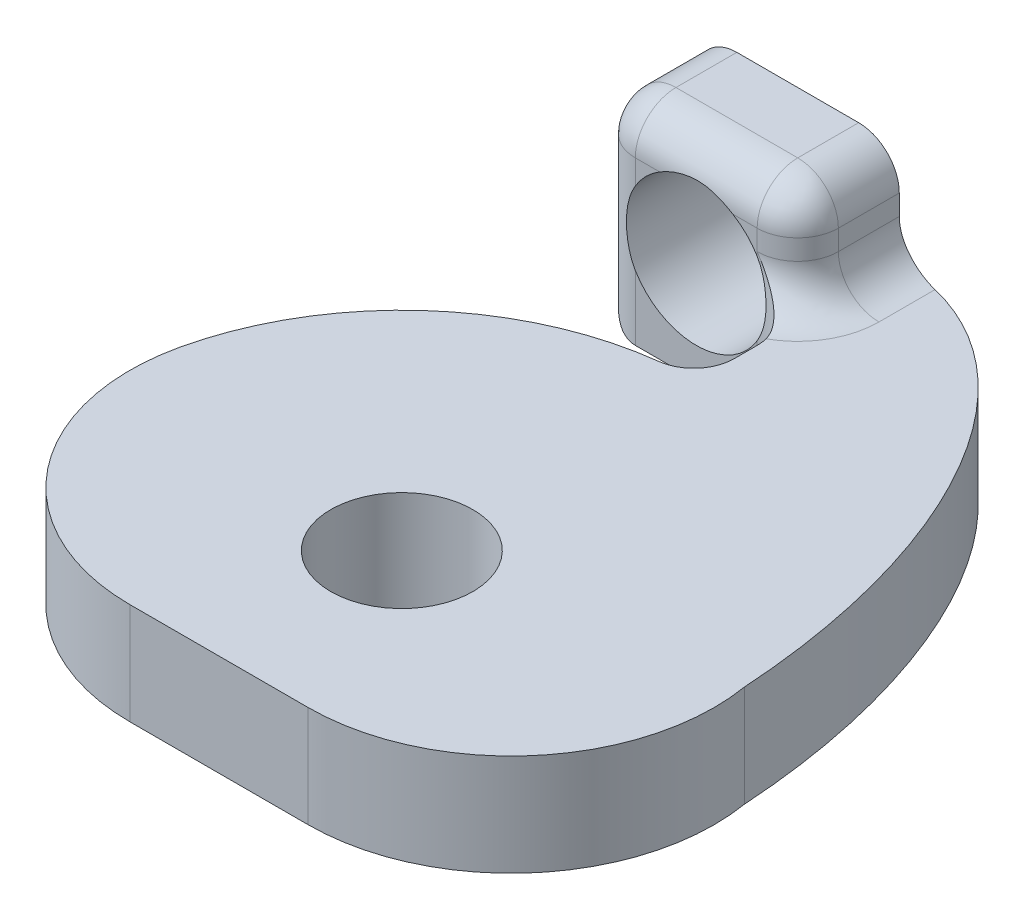
ISO-10303-21;
HEADER;
FILE_DESCRIPTION(('STEP AP214'),'2;1');
FILE_NAME('part.step','',(''),(''),'','','');
FILE_SCHEMA(('AUTOMOTIVE_DESIGN { 1 0 10303 214 1 1 1 1 }'));
ENDSEC;
DATA;
#1=APPLICATION_CONTEXT('core data for automotive mechanical design processes');
#2=APPLICATION_PROTOCOL_DEFINITION('international standard','automotive_design',2000,#1);
#3=PRODUCT_CONTEXT('',#1,'mechanical');
#4=PRODUCT('Part','Part','',(#3));
#5=PRODUCT_RELATED_PRODUCT_CATEGORY('part','',(#4));
#6=PRODUCT_DEFINITION_FORMATION('','',#4);
#7=PRODUCT_DEFINITION_CONTEXT('part definition',#1,'design');
#8=PRODUCT_DEFINITION('design','',#6,#7);
#9=PRODUCT_DEFINITION_SHAPE('','',#8);
#10=(LENGTH_UNIT() NAMED_UNIT(*) SI_UNIT(.MILLI.,.METRE.));
#11=(NAMED_UNIT(*) PLANE_ANGLE_UNIT() SI_UNIT($,.RADIAN.));
#12=(NAMED_UNIT(*) SI_UNIT($,.STERADIAN.) SOLID_ANGLE_UNIT());
#13=UNCERTAINTY_MEASURE_WITH_UNIT(LENGTH_MEASURE(1.E-05),#10,'distance_accuracy_value','');
#14=(GEOMETRIC_REPRESENTATION_CONTEXT(3) GLOBAL_UNCERTAINTY_ASSIGNED_CONTEXT((#13)) GLOBAL_UNIT_ASSIGNED_CONTEXT((#10,
#11,#12)) REPRESENTATION_CONTEXT('',''));
#15=CARTESIAN_POINT('',(0.,0.,0.));
#16=DIRECTION('',(0.,0.,1.));
#17=DIRECTION('',(1.,0.,0.));
#18=AXIS2_PLACEMENT_3D('',#15,#16,#17);
#19=CARTESIAN_POINT('',(-10.,5.,-19.5));
#20=DIRECTION('',(0.,0.,-1.));
#21=DIRECTION('',(-1.,0.,0.));
#22=AXIS2_PLACEMENT_3D('',#19,#20,#21);
#23=PLANE('',#22);
#24=DIRECTION('',(0.,-1.,0.));
#25=VECTOR('',#24,1.);
#26=CARTESIAN_POINT('',(-8.,5.,-19.5));
#27=LINE('',#26,#25);
#28=CARTESIAN_POINT('',(-8.,8.,-19.5));
#29=VERTEX_POINT('',#28);
#30=CARTESIAN_POINT('',(-8.,6.802775637732,-19.5));
#31=VERTEX_POINT('',#30);
#32=EDGE_CURVE('E203',#29,#31,#27,.T.);
#33=ORIENTED_EDGE('',*,*,#32,.T.);
#34=CARTESIAN_POINT('',(-5.,5.,-19.5));
#35=DIRECTION('',(0.,0.,-1.));
#36=DIRECTION('',(-1.,0.,0.));
#37=AXIS2_PLACEMENT_3D('',#34,#35,#36);
#38=CIRCLE('',#37,3.5);
#39=CARTESIAN_POINT('',(-6.802775637732,8.,-19.5));
#40=VERTEX_POINT('',#39);
#41=EDGE_CURVE('E190',#40,#31,#38,.F.);
#42=ORIENTED_EDGE('',*,*,#41,.F.);
#43=DIRECTION('',(1.,0.,0.));
#44=VECTOR('',#43,1.);
#45=CARTESIAN_POINT('',(-10.,8.,-19.5));
#46=LINE('',#45,#44);
#47=EDGE_CURVE('E201',#40,#29,#46,.F.);
#48=ORIENTED_EDGE('',*,*,#47,.T.);
#49=EDGE_LOOP('',(#33,#42,#48));
#50=FACE_BOUND('',#49,.T.);
#51=ADVANCED_FACE('F45',(#50),#23,.F.);
#52=CARTESIAN_POINT('',(-2.,8.,-19.5));
#53=VERTEX_POINT('',#52);
#54=CARTESIAN_POINT('',(-3.197224362268,8.,-19.5));
#55=VERTEX_POINT('',#54);
#56=EDGE_CURVE('E213',#53,#55,#46,.F.);
#57=ORIENTED_EDGE('',*,*,#56,.T.);
#58=CARTESIAN_POINT('',(-2.00000000000001,6.80277563773202,-19.5));
#59=VERTEX_POINT('',#58);
#60=EDGE_CURVE('E63',#59,#55,#38,.F.);
#61=ORIENTED_EDGE('',*,*,#60,.F.);
#62=DIRECTION('',(0.,-1.,0.));
#63=VECTOR('',#62,1.);
#64=CARTESIAN_POINT('',(-2.00000000000001,5.,-19.5));
#65=LINE('',#64,#63);
#66=CARTESIAN_POINT('',(-2.,7.,-19.5));
#67=VERTEX_POINT('',#66);
#68=EDGE_CURVE('E437',#67,#59,#65,.T.);
#69=ORIENTED_EDGE('',*,*,#68,.F.);
#70=DIRECTION('',(0.,-1.,0.));
#71=VECTOR('',#70,1.);
#72=CARTESIAN_POINT('',(-2.,10.,-19.5));
#73=LINE('',#72,#71);
#74=EDGE_CURVE('E217',#67,#53,#73,.F.);
#75=ORIENTED_EDGE('',*,*,#74,.T.);
#76=EDGE_LOOP('',(#57,#61,#69,#75));
#77=FACE_BOUND('',#76,.T.);
#78=ADVANCED_FACE('F602',(#77),#23,.F.);
#79=CARTESIAN_POINT('',(0.,5.,0.));
#80=DIRECTION('',(0.,1.,0.));
#81=DIRECTION('',(0.,0.,1.));
#82=AXIS2_PLACEMENT_3D('',#79,#80,#81);
#83=PLANE('',#82);
#84=DIRECTION('',(0.,0.,-1.));
#85=VECTOR('',#84,1.);
#86=CARTESIAN_POINT('',(2.,5.,-21.5));
#87=LINE('',#86,#85);
#88=CARTESIAN_POINT('',(2.,5.,-24.260455483341));
#89=VERTEX_POINT('',#88);
#90=CARTESIAN_POINT('',(2.,5.,-21.5));
#91=VERTEX_POINT('',#90);
#92=EDGE_CURVE('E254',#89,#91,#87,.F.);
#93=ORIENTED_EDGE('',*,*,#92,.T.);
#94=CARTESIAN_POINT('',(-2.,5.,-21.5));
#95=DIRECTION('',(0.,1.,0.));
#96=DIRECTION('',(0.,0.,1.));
#97=AXIS2_PLACEMENT_3D('',#94,#95,#96);
#98=CIRCLE('',#97,4.);
#99=CARTESIAN_POINT('',(-0.0635083268962909,5.,-18.));
#100=VERTEX_POINT('',#99);
#101=EDGE_CURVE('E284',#91,#100,#98,.F.);
#102=ORIENTED_EDGE('',*,*,#101,.T.);
#103=CARTESIAN_POINT('',(-2.,5.,-17.5));
#104=DIRECTION('',(0.,-1.,0.));
#105=DIRECTION('',(0.,0.,1.));
#106=AXIS2_PLACEMENT_3D('',#103,#104,#105);
#107=CIRCLE('',#106,2.);
#108=CARTESIAN_POINT('',(0.,5.,-17.5));
#109=VERTEX_POINT('',#108);
#110=EDGE_CURVE('E371',#100,#109,#107,.T.);
#111=ORIENTED_EDGE('',*,*,#110,.T.);
#112=DIRECTION('',(0.,0.,1.));
#113=VECTOR('',#112,1.);
#114=CARTESIAN_POINT('',(0.,5.,-17.5));
#115=LINE('',#114,#113);
#116=CARTESIAN_POINT('',(0.,5.,-16.3783393541592));
#117=VERTEX_POINT('',#116);
#118=EDGE_CURVE('E376',#109,#117,#115,.T.);
#119=ORIENTED_EDGE('',*,*,#118,.T.);
#120=CARTESIAN_POINT('',(-2.,5.,-16.3783393541592));
#121=DIRECTION('',(0.,-1.,0.));
#122=DIRECTION('',(0.,0.,-1.));
#123=AXIS2_PLACEMENT_3D('',#120,#121,#122);
#124=CIRCLE('',#123,2.);
#125=CARTESIAN_POINT('',(-1.75757575757575,5.,-14.3930860991096));
#126=VERTEX_POINT('',#125);
#127=EDGE_CURVE('E379',#117,#126,#124,.T.);
#128=ORIENTED_EDGE('',*,*,#127,.T.);
#129=CARTESIAN_POINT('',(0.,5.,0.));
#130=DIRECTION('',(0.,1.,0.));
#131=DIRECTION('',(0.,0.,1.));
#132=AXIS2_PLACEMENT_3D('',#129,#130,#131);
#133=CIRCLE('',#132,14.5);
#134=CARTESIAN_POINT('',(-14.1374426241317,5.,-3.22222222222224));
#135=VERTEX_POINT('',#134);
#136=EDGE_CURVE('E382',#126,#135,#133,.T.);
#137=ORIENTED_EDGE('',*,*,#136,.T.);
#138=CARTESIAN_POINT('',(-4.38748219369606,5.,-1.));
#139=DIRECTION('',(0.,1.,0.));
#140=DIRECTION('',(0.,0.,1.));
#141=AXIS2_PLACEMENT_3D('',#138,#139,#140);
#142=CIRCLE('',#141,10.);
#143=CARTESIAN_POINT('',(-4.38748219369606,5.,9.));
#144=VERTEX_POINT('',#143);
#145=EDGE_CURVE('E420',#135,#144,#142,.T.);
#146=ORIENTED_EDGE('',*,*,#145,.T.);
#147=DIRECTION('',(1.,0.,0.));
#148=VECTOR('',#147,1.);
#149=CARTESIAN_POINT('',(-4.38748219369606,5.,9.));
#150=LINE('',#149,#148);
#151=CARTESIAN_POINT('',(4.38748219369606,5.,9.00000000000171));
#152=VERTEX_POINT('',#151);
#153=EDGE_CURVE('E523',#144,#152,#150,.T.);
#154=ORIENTED_EDGE('',*,*,#153,.T.);
#155=CARTESIAN_POINT('',(4.38748219369606,5.,-1.));
#156=DIRECTION('',(0.,1.,0.));
#157=DIRECTION('',(0.,0.,-1.));
#158=AXIS2_PLACEMENT_3D('',#155,#156,#157);
#159=CIRCLE('',#158,10.0000000000017);
#160=CARTESIAN_POINT('',(14.2549856396273,5.,-2.62245978212194));
#161=VERTEX_POINT('',#160);
#162=EDGE_CURVE('E372',#152,#161,#159,.T.);
#163=ORIENTED_EDGE('',*,*,#162,.T.);
#164=CARTESIAN_POINT('',(0.,5.,0.));
#165=DIRECTION('',(0.,1.,0.));
#166=DIRECTION('',(0.,0.,-1.));
#167=AXIS2_PLACEMENT_3D('',#164,#165,#166);
#168=ELLIPSE('',#167,24.5,14.3373565647623);
#169=EDGE_CURVE('E365',#161,#89,#168,.T.);
#170=ORIENTED_EDGE('',*,*,#169,.T.);
#171=EDGE_LOOP('',(#93,#102,#111,#119,#128,#137,#146,#154,#163,#170));
#172=FACE_BOUND('',#171,.T.);
#173=CARTESIAN_POINT('',(0.,5.,0.));
#174=DIRECTION('',(0.,1.,0.));
#175=DIRECTION('',(0.,0.,1.));
#176=AXIS2_PLACEMENT_3D('',#173,#174,#175);
#177=CIRCLE('',#176,3.5);
#178=CARTESIAN_POINT('',(0.,5.,3.5));
#179=VERTEX_POINT('',#178);
#180=EDGE_CURVE('E391',#179,#179,#177,.T.);
#181=ORIENTED_EDGE('',*,*,#180,.F.);
#182=EDGE_LOOP('',(#181));
#183=FACE_BOUND('',#182,.T.);
#184=ADVANCED_FACE('F530',(#172,#183),#83,.T.);
#185=CARTESIAN_POINT('',(0.,0.,0.));
#186=DIRECTION('',(0.,1.,0.));
#187=DIRECTION('',(0.,0.,1.));
#188=AXIS2_PLACEMENT_3D('',#185,#186,#187);
#189=PLANE('',#188);
#190=DIRECTION('',(1.,0.,0.));
#191=VECTOR('',#190,1.);
#192=CARTESIAN_POINT('',(-10.,0.,-19.5));
#193=LINE('',#192,#191);
#194=CARTESIAN_POINT('',(-8.,0.,-19.5));
#195=VERTEX_POINT('',#194);
#196=CARTESIAN_POINT('',(-2.00000000000001,0.,-19.5));
#197=VERTEX_POINT('',#196);
#198=EDGE_CURVE('E404',#195,#197,#193,.T.);
#199=ORIENTED_EDGE('',*,*,#198,.F.);
#200=DIRECTION('',(0.,0.,1.));
#201=VECTOR('',#200,1.);
#202=CARTESIAN_POINT('',(-7.99999999999999,0.,0.));
#203=LINE('',#202,#201);
#204=CARTESIAN_POINT('',(-8.,0.,-24.5));
#205=VERTEX_POINT('',#204);
#206=EDGE_CURVE('E242',#195,#205,#203,.F.);
#207=ORIENTED_EDGE('',*,*,#206,.T.);
#208=DIRECTION('',(-1.,0.,0.));
#209=VECTOR('',#208,1.);
#210=CARTESIAN_POINT('',(0.,0.,-24.5));
#211=LINE('',#210,#209);
#212=CARTESIAN_POINT('',(0.,0.,-24.5));
#213=VERTEX_POINT('',#212);
#214=EDGE_CURVE('E400',#213,#205,#211,.T.);
#215=ORIENTED_EDGE('',*,*,#214,.F.);
#216=CARTESIAN_POINT('',(0.,0.,0.));
#217=DIRECTION('',(0.,1.,0.));
#218=DIRECTION('',(0.,0.,-1.));
#219=AXIS2_PLACEMENT_3D('',#216,#217,#218);
#220=ELLIPSE('',#219,24.5,14.3373565647623);
#221=CARTESIAN_POINT('',(14.2549856396273,0.,-2.62245978212194));
#222=VERTEX_POINT('',#221);
#223=EDGE_CURVE('E397',#222,#213,#220,.T.);
#224=ORIENTED_EDGE('',*,*,#223,.F.);
#225=CARTESIAN_POINT('',(4.38748219369606,0.,-1.));
#226=DIRECTION('',(0.,1.,0.));
#227=DIRECTION('',(0.,0.,-1.));
#228=AXIS2_PLACEMENT_3D('',#225,#226,#227);
#229=CIRCLE('',#228,10.0000000000017);
#230=CARTESIAN_POINT('',(4.38748219369606,0.,9.00000000000171));
#231=VERTEX_POINT('',#230);
#232=EDGE_CURVE('E394',#231,#222,#229,.T.);
#233=ORIENTED_EDGE('',*,*,#232,.F.);
#234=DIRECTION('',(1.,0.,0.));
#235=VECTOR('',#234,1.);
#236=CARTESIAN_POINT('',(-4.38748219369606,0.,9.));
#237=LINE('',#236,#235);
#238=CARTESIAN_POINT('',(-4.38748219369606,0.,9.));
#239=VERTEX_POINT('',#238);
#240=EDGE_CURVE('E390',#239,#231,#237,.T.);
#241=ORIENTED_EDGE('',*,*,#240,.F.);
#242=CARTESIAN_POINT('',(-4.38748219369606,0.,-1.));
#243=DIRECTION('',(0.,1.,0.));
#244=DIRECTION('',(0.,0.,1.));
#245=AXIS2_PLACEMENT_3D('',#242,#243,#244);
#246=CIRCLE('',#245,10.);
#247=CARTESIAN_POINT('',(-14.1374426241317,0.,-3.22222222222224));
#248=VERTEX_POINT('',#247);
#249=EDGE_CURVE('E386',#248,#239,#246,.T.);
#250=ORIENTED_EDGE('',*,*,#249,.F.);
#251=CARTESIAN_POINT('',(0.,0.,0.));
#252=DIRECTION('',(0.,1.,0.));
#253=DIRECTION('',(0.,0.,1.));
#254=AXIS2_PLACEMENT_3D('',#251,#252,#253);
#255=CIRCLE('',#254,14.5);
#256=CARTESIAN_POINT('',(-1.75757575757575,0.,-14.3930860991096));
#257=VERTEX_POINT('',#256);
#258=EDGE_CURVE('E417',#257,#248,#255,.T.);
#259=ORIENTED_EDGE('',*,*,#258,.F.);
#260=CARTESIAN_POINT('',(-2.,0.,-16.3783393541592));
#261=DIRECTION('',(0.,-1.,0.));
#262=DIRECTION('',(0.,0.,-1.));
#263=AXIS2_PLACEMENT_3D('',#260,#261,#262);
#264=CIRCLE('',#263,2.);
#265=CARTESIAN_POINT('',(0.,0.,-16.3783393541592));
#266=VERTEX_POINT('',#265);
#267=EDGE_CURVE('E414',#266,#257,#264,.T.);
#268=ORIENTED_EDGE('',*,*,#267,.F.);
#269=DIRECTION('',(0.,0.,1.));
#270=VECTOR('',#269,1.);
#271=CARTESIAN_POINT('',(0.,0.,-17.5));
#272=LINE('',#271,#270);
#273=CARTESIAN_POINT('',(0.,0.,-17.5));
#274=VERTEX_POINT('',#273);
#275=EDGE_CURVE('E411',#274,#266,#272,.T.);
#276=ORIENTED_EDGE('',*,*,#275,.F.);
#277=CARTESIAN_POINT('',(-2.,0.,-17.5));
#278=DIRECTION('',(0.,-1.,0.));
#279=DIRECTION('',(0.,0.,1.));
#280=AXIS2_PLACEMENT_3D('',#277,#278,#279);
#281=CIRCLE('',#280,2.);
#282=EDGE_CURVE('E408',#197,#274,#281,.T.);
#283=ORIENTED_EDGE('',*,*,#282,.F.);
#284=EDGE_LOOP('',(#199,#207,#215,#224,#233,#241,#250,#259,#268,#276,#283));
#285=FACE_BOUND('',#284,.T.);
#286=CARTESIAN_POINT('',(0.,0.,0.));
#287=DIRECTION('',(0.,1.,0.));
#288=DIRECTION('',(0.,0.,1.));
#289=AXIS2_PLACEMENT_3D('',#286,#287,#288);
#290=CIRCLE('',#289,3.5);
#291=CARTESIAN_POINT('',(0.,0.,3.5));
#292=VERTEX_POINT('',#291);
#293=EDGE_CURVE('E503',#292,#292,#290,.T.);
#294=ORIENTED_EDGE('',*,*,#293,.T.);
#295=EDGE_LOOP('',(#294));
#296=FACE_BOUND('',#295,.T.);
#297=ADVANCED_FACE('F350',(#285,#296),#189,.F.);
#298=CARTESIAN_POINT('',(-4.38748219369606,5.,-1.));
#299=DIRECTION('',(0.,-1.,0.));
#300=DIRECTION('',(0.,0.,-1.));
#301=AXIS2_PLACEMENT_3D('',#298,#299,#300);
#302=CYLINDRICAL_SURFACE('',#301,10.);
#303=ORIENTED_EDGE('',*,*,#249,.T.);
#304=DIRECTION('',(0.,-1.,0.));
#305=VECTOR('',#304,1.);
#306=CARTESIAN_POINT('',(-4.38748219369606,5.,9.));
#307=LINE('',#306,#305);
#308=EDGE_CURVE('E455',#144,#239,#307,.T.);
#309=ORIENTED_EDGE('',*,*,#308,.F.);
#310=ORIENTED_EDGE('',*,*,#145,.F.);
#311=DIRECTION('',(0.,-1.,0.));
#312=VECTOR('',#311,1.);
#313=CARTESIAN_POINT('',(-14.1374426241317,5.,-3.22222222222224));
#314=LINE('',#313,#312);
#315=EDGE_CURVE('E385',#135,#248,#314,.T.);
#316=ORIENTED_EDGE('',*,*,#315,.T.);
#317=EDGE_LOOP('',(#303,#309,#310,#316));
#318=FACE_BOUND('',#317,.T.);
#319=ADVANCED_FACE('F346',(#318),#302,.T.);
#320=CARTESIAN_POINT('',(-4.38748219369606,5.,9.));
#321=DIRECTION('',(0.,0.,-1.));
#322=DIRECTION('',(-1.,0.,0.));
#323=AXIS2_PLACEMENT_3D('',#320,#321,#322);
#324=PLANE('',#323);
#325=ORIENTED_EDGE('',*,*,#240,.T.);
#326=DIRECTION('',(0.,-1.,0.));
#327=VECTOR('',#326,1.);
#328=CARTESIAN_POINT('',(4.38748219369606,5.,9.00000000000171));
#329=LINE('',#328,#327);
#330=EDGE_CURVE('E451',#152,#231,#329,.T.);
#331=ORIENTED_EDGE('',*,*,#330,.F.);
#332=ORIENTED_EDGE('',*,*,#153,.F.);
#333=ORIENTED_EDGE('',*,*,#308,.T.);
#334=EDGE_LOOP('',(#325,#331,#332,#333));
#335=FACE_BOUND('',#334,.T.);
#336=ADVANCED_FACE('F349',(#335),#324,.F.);
#337=CARTESIAN_POINT('',(4.38748219369606,5.,-1.));
#338=DIRECTION('',(0.,-1.,0.));
#339=DIRECTION('',(0.,0.,-1.));
#340=AXIS2_PLACEMENT_3D('',#337,#338,#339);
#341=CYLINDRICAL_SURFACE('',#340,10.0000000000017);
#342=ORIENTED_EDGE('',*,*,#232,.T.);
#343=DIRECTION('',(0.,-1.,0.));
#344=VECTOR('',#343,1.);
#345=CARTESIAN_POINT('',(14.2549856396273,5.,-2.62245978212194));
#346=LINE('',#345,#344);
#347=EDGE_CURVE('E447',#161,#222,#346,.T.);
#348=ORIENTED_EDGE('',*,*,#347,.F.);
#349=ORIENTED_EDGE('',*,*,#162,.F.);
#350=ORIENTED_EDGE('',*,*,#330,.T.);
#351=EDGE_LOOP('',(#342,#348,#349,#350));
#352=FACE_BOUND('',#351,.T.);
#353=ADVANCED_FACE('F354',(#352),#341,.T.);
#354=DIRECTION('',(0.,-1.,0.));
#355=VECTOR('',#354,1.);
#356=SURFACE_OF_LINEAR_EXTRUSION('',#168,#355);
#357=ORIENTED_EDGE('',*,*,#223,.T.);
#358=DIRECTION('',(0.,-1.,0.));
#359=VECTOR('',#358,1.);
#360=CARTESIAN_POINT('',(0.,5.,-24.5));
#361=LINE('',#360,#359);
#362=CARTESIAN_POINT('',(0.,7.,-24.5));
#363=VERTEX_POINT('',#362);
#364=EDGE_CURVE('E70',#363,#213,#361,.T.);
#365=ORIENTED_EDGE('',*,*,#364,.F.);
#366=CARTESIAN_POINT('',(0.,7.,-24.5));
#367=CARTESIAN_POINT('',(-5.73329897597098E-07,6.94376198497631,-24.499996762425));
#368=CARTESIAN_POINT('',(0.0023731630430719,6.88754885701935,-24.5000003740362));
#369=CARTESIAN_POINT('',(0.011841801586754,6.77552733629461,-24.4999936050275));
#370=CARTESIAN_POINT('',(0.0189362318756099,6.71971890363699,-24.499983225806));
#371=CARTESIAN_POINT('',(0.0472313706462909,6.55358480367156,-24.4998896745324));
#372=CARTESIAN_POINT('',(0.0754441126646444,6.44437705725369,-24.4997442473447));
#373=CARTESIAN_POINT('',(0.149831074784767,6.23219837276328,-24.4987435796133));
#374=CARTESIAN_POINT('',(0.196014473399098,6.1292306528941,-24.4978879760937));
#375=CARTESIAN_POINT('',(0.277661896399248,5.98180718877938,-24.4954487502452));
#376=CARTESIAN_POINT('',(0.306943932016167,5.93383215530552,-24.4944428518072));
#377=CARTESIAN_POINT('',(0.369459751369972,5.84047524968967,-24.4919226151268));
#378=CARTESIAN_POINT('',(0.402697405456561,5.79509598269829,-24.4904077762293));
#379=CARTESIAN_POINT('',(0.507743855649595,5.66369922388755,-24.4849235257224));
#380=CARTESIAN_POINT('',(0.585092556822705,5.58205121854287,-24.4800101722659));
#381=CARTESIAN_POINT('',(0.752203059356871,5.43298557142037,-24.4666736385839));
#382=CARTESIAN_POINT('',(0.841963657429657,5.3655665517928,-24.4582507984312));
#383=CARTESIAN_POINT('',(0.983285255921126,5.27681586529151,-24.4424468503204));
#384=CARTESIAN_POINT('',(1.03129314018153,5.24938381004181,-24.4366809699894));
#385=CARTESIAN_POINT('',(1.12926343331795,5.19865224153642,-24.4240299999586));
#386=CARTESIAN_POINT('',(1.17922405676836,5.17534905629133,-24.4171459152802));
#387=CARTESIAN_POINT('',(1.2807568177799,5.13299263154228,-24.4022062853747));
#388=CARTESIAN_POINT('',(1.33232932534359,5.11394037611567,-24.3941504696069));
#389=CARTESIAN_POINT('',(1.43668103296958,5.08018725317289,-24.3768507895118));
#390=CARTESIAN_POINT('',(1.48946025774709,5.06548647486704,-24.3676069008332));
#391=CARTESIAN_POINT('',(1.61802003624888,5.03529298282747,-24.3438279422737));
#392=CARTESIAN_POINT('',(1.69422095386422,5.02202276748049,-24.3286931086078));
#393=CARTESIAN_POINT('',(1.84704419075483,5.0043690179365,-24.2962040898979));
#394=CARTESIAN_POINT('',(1.92366559564486,4.99997070449228,-24.2788536470907));
#395=CARTESIAN_POINT('',(2.,5.,-24.260455483341));
#396=B_SPLINE_CURVE_WITH_KNOTS('',3,(#366,#367,#368,#369,#370,#371,#372,#373,#374,#375,#376,
#377,#378,#379,#380,#381,#382,#383,#384,#385,#386,#387,#388,#389,#390,#391,#392,#393,#394,#395),
.UNSPECIFIED.,.F.,.F.,(4,2,2,2,2,2,2,2,2,2,2,2,2,2,4),(0.,0.168614577251063,0.337212302274285,
0.673894591463427,1.01074906731898,1.17921595581719,1.34784905623707,1.68385662791386,
2.01983164768679,2.18644258195801,2.35290458965494,2.51940509291058,2.68590900938309,
2.92179323427445,3.15728418611128),.UNSPECIFIED.);
#397=EDGE_CURVE('E11',#363,#89,#396,.T.);
#398=ORIENTED_EDGE('',*,*,#397,.T.);
#399=ORIENTED_EDGE('',*,*,#169,.F.);
#400=ORIENTED_EDGE('',*,*,#347,.T.);
#401=EDGE_LOOP('',(#357,#365,#398,#399,#400));
#402=FACE_BOUND('',#401,.T.);
#403=ADVANCED_FACE('F357',(#402),#356,.F.);
#404=CARTESIAN_POINT('',(0.,5.,-24.5));
#405=DIRECTION('',(0.,0.,1.));
#406=DIRECTION('',(1.,0.,0.));
#407=AXIS2_PLACEMENT_3D('',#404,#405,#406);
#408=PLANE('',#407);
#409=CARTESIAN_POINT('',(-5.,5.,-24.5));
#410=DIRECTION('',(0.,0.,-1.));
#411=DIRECTION('',(-1.,0.,0.));
#412=AXIS2_PLACEMENT_3D('',#409,#410,#411);
#413=CIRCLE('',#412,3.5);
#414=CARTESIAN_POINT('',(-8.5,5.,-24.5));
#415=VERTEX_POINT('',#414);
#416=EDGE_CURVE('E197',#415,#415,#413,.T.);
#417=ORIENTED_EDGE('',*,*,#416,.F.);
#418=EDGE_LOOP('',(#417));
#419=FACE_BOUND('',#418,.T.);
#420=ORIENTED_EDGE('',*,*,#214,.T.);
#421=CARTESIAN_POINT('',(-8.,2.,-24.5));
#422=DIRECTION('',(0.,0.,1.));
#423=DIRECTION('',(1.,0.,0.));
#424=AXIS2_PLACEMENT_3D('',#421,#422,#423);
#425=CIRCLE('',#424,2.);
#426=CARTESIAN_POINT('',(-10.,2.,-24.5));
#427=VERTEX_POINT('',#426);
#428=EDGE_CURVE('E251',#205,#427,#425,.F.);
#429=ORIENTED_EDGE('',*,*,#428,.T.);
#430=DIRECTION('',(0.,-1.,0.));
#431=VECTOR('',#430,1.);
#432=CARTESIAN_POINT('',(-10.,5.,-24.5));
#433=LINE('',#432,#431);
#434=CARTESIAN_POINT('',(-10.,8.,-24.5));
#435=VERTEX_POINT('',#434);
#436=EDGE_CURVE('E441',#435,#427,#433,.T.);
#437=ORIENTED_EDGE('',*,*,#436,.F.);
#438=CARTESIAN_POINT('',(-8.,8.,-24.5));
#439=DIRECTION('',(0.,0.,1.));
#440=DIRECTION('',(1.,0.,0.));
#441=AXIS2_PLACEMENT_3D('',#438,#439,#440);
#442=CIRCLE('',#441,2.);
#443=CARTESIAN_POINT('',(-8.,10.,-24.5));
#444=VERTEX_POINT('',#443);
#445=EDGE_CURVE('E248',#435,#444,#442,.F.);
#446=ORIENTED_EDGE('',*,*,#445,.T.);
#447=DIRECTION('',(1.,0.,0.));
#448=VECTOR('',#447,1.);
#449=CARTESIAN_POINT('',(0.,10.,-24.5));
#450=LINE('',#449,#448);
#451=CARTESIAN_POINT('',(-2.,10.,-24.5));
#452=VERTEX_POINT('',#451);
#453=EDGE_CURVE('E281',#444,#452,#450,.T.);
#454=ORIENTED_EDGE('',*,*,#453,.T.);
#455=CARTESIAN_POINT('',(-2.,8.,-24.5));
#456=DIRECTION('',(0.,0.,1.));
#457=DIRECTION('',(1.,0.,0.));
#458=AXIS2_PLACEMENT_3D('',#455,#456,#457);
#459=CIRCLE('',#458,2.);
#460=CARTESIAN_POINT('',(0.,8.,-24.5));
#461=VERTEX_POINT('',#460);
#462=EDGE_CURVE('E245',#452,#461,#459,.F.);
#463=ORIENTED_EDGE('',*,*,#462,.T.);
#464=DIRECTION('',(0.,-1.,0.));
#465=VECTOR('',#464,1.);
#466=CARTESIAN_POINT('',(0.,5.,-24.5));
#467=LINE('',#466,#465);
#468=EDGE_CURVE('E499',#461,#363,#467,.T.);
#469=ORIENTED_EDGE('',*,*,#468,.T.);
#470=ORIENTED_EDGE('',*,*,#364,.T.);
#471=EDGE_LOOP('',(#420,#429,#437,#446,#454,#463,#469,#470));
#472=FACE_BOUND('',#471,.T.);
#473=ADVANCED_FACE('F363',(#419,#472),#408,.F.);
#474=CARTESIAN_POINT('',(-10.,5.,-24.5));
#475=DIRECTION('',(1.,0.,0.));
#476=DIRECTION('',(0.,0.,-1.));
#477=AXIS2_PLACEMENT_3D('',#474,#475,#476);
#478=PLANE('',#477);
#479=ORIENTED_EDGE('',*,*,#436,.T.);
#480=DIRECTION('',(0.,0.,1.));
#481=VECTOR('',#480,1.);
#482=CARTESIAN_POINT('',(-10.,2.,-24.5));
#483=LINE('',#482,#481);
#484=CARTESIAN_POINT('',(-10.,2.,-21.5));
#485=VERTEX_POINT('',#484);
#486=EDGE_CURVE('E239',#427,#485,#483,.T.);
#487=ORIENTED_EDGE('',*,*,#486,.T.);
#488=DIRECTION('',(0.,-1.,0.));
#489=VECTOR('',#488,1.);
#490=CARTESIAN_POINT('',(-10.,5.,-21.5));
#491=LINE('',#490,#489);
#492=CARTESIAN_POINT('',(-10.,8.,-21.5));
#493=VERTEX_POINT('',#492);
#494=EDGE_CURVE('E236',#485,#493,#491,.F.);
#495=ORIENTED_EDGE('',*,*,#494,.T.);
#496=DIRECTION('',(0.,0.,-1.));
#497=VECTOR('',#496,1.);
#498=CARTESIAN_POINT('',(-10.,8.,-24.5));
#499=LINE('',#498,#497);
#500=EDGE_CURVE('E233',#493,#435,#499,.T.);
#501=ORIENTED_EDGE('',*,*,#500,.T.);
#502=EDGE_LOOP('',(#479,#487,#495,#501));
#503=FACE_BOUND('',#502,.T.);
#504=ADVANCED_FACE('F487',(#503),#478,.F.);
#505=CARTESIAN_POINT('',(-2.00000000000001,3.19722436226798,-19.5));
#506=VERTEX_POINT('',#505);
#507=EDGE_CURVE('E436',#506,#197,#65,.T.);
#508=ORIENTED_EDGE('',*,*,#507,.F.);
#509=CARTESIAN_POINT('',(-8.,3.197224362268,-19.5));
#510=VERTEX_POINT('',#509);
#511=EDGE_CURVE('E206',#510,#506,#38,.F.);
#512=ORIENTED_EDGE('',*,*,#511,.F.);
#513=EDGE_CURVE('E218',#510,#195,#27,.T.);
#514=ORIENTED_EDGE('',*,*,#513,.T.);
#515=ORIENTED_EDGE('',*,*,#198,.T.);
#516=EDGE_LOOP('',(#508,#512,#514,#515));
#517=FACE_BOUND('',#516,.T.);
#518=ADVANCED_FACE('F473',(#517),#23,.F.);
#519=CARTESIAN_POINT('',(-2.,5.,-17.5));
#520=DIRECTION('',(0.,-1.,0.));
#521=DIRECTION('',(0.,0.,-1.));
#522=AXIS2_PLACEMENT_3D('',#519,#520,#521);
#523=CYLINDRICAL_SURFACE('',#522,2.);
#524=ORIENTED_EDGE('',*,*,#68,.T.);
#525=CARTESIAN_POINT('',(-2.00000000000001,3.19722436226798,-19.5));
#526=CARTESIAN_POINT('',(-1.95643555946663,3.2697086866449,-19.4999827238607));
#527=CARTESIAN_POINT('',(-1.91552129647934,3.34375553579305,-19.49857650522));
#528=CARTESIAN_POINT('',(-1.83919133016534,3.49453833696708,-19.4938956727861));
#529=CARTESIAN_POINT('',(-1.80377329331528,3.57127313072181,-19.4906218546923));
#530=CARTESIAN_POINT('',(-1.73855758420693,3.72715149119125,-19.4831092592398));
#531=CARTESIAN_POINT('',(-1.70876668828382,3.80629783048534,-19.4788693318492));
#532=CARTESIAN_POINT('',(-1.65498767752938,3.96654167173229,-19.4702054324619));
#533=CARTESIAN_POINT('',(-1.63100061008219,4.04763952296452,-19.4657814274144));
#534=CARTESIAN_POINT('',(-1.58594655419738,4.22310055288928,-19.4568246335951));
#535=CARTESIAN_POINT('',(-1.56578756712462,4.31770238615583,-19.4523667455961));
#536=CARTESIAN_POINT('',(-1.53336101695524,4.50830879983314,-19.4448716005885));
#537=CARTESIAN_POINT('',(-1.5210937707798,4.60431343642019,-19.4418344006343));
#538=CARTESIAN_POINT('',(-1.50455418882323,4.79701000713327,-19.4376807882448));
#539=CARTESIAN_POINT('',(-1.50027826747245,4.89370161347007,-19.43656351439));
#540=CARTESIAN_POINT('',(-1.49974805003715,5.08710347940632,-19.4364266272096));
#541=CARTESIAN_POINT('',(-1.5034933533974,5.1838137378332,-19.4374069091384));
#542=CARTESIAN_POINT('',(-1.51894210798304,5.37618022929972,-19.441300037644));
#543=CARTESIAN_POINT('',(-1.53061491113259,5.47183908505239,-19.4442054405653));
#544=CARTESIAN_POINT('',(-1.56179495692913,5.66182690169459,-19.4514691033928));
#545=CARTESIAN_POINT('',(-1.58130335745243,5.75615566390113,-19.4558275780052));
#546=CARTESIAN_POINT('',(-1.62799965349337,5.94279530797545,-19.4652434839081));
#547=CARTESIAN_POINT('',(-1.65518310366596,6.03510732468404,-19.4703005097384));
#548=CARTESIAN_POINT('',(-1.71704978440934,6.21715889235789,-19.4801309167557));
#549=CARTESIAN_POINT('',(-1.75172968582668,6.30689956527808,-19.4849044226574));
#550=CARTESIAN_POINT('',(-1.82055491898619,6.46525859631782,-19.4921699863131));
#551=CARTESIAN_POINT('',(-1.85336316585085,6.53444795863775,-19.4949288760844));
#552=CARTESIAN_POINT('',(-1.92339798307041,6.67043865384415,-19.4988368231499));
#553=CARTESIAN_POINT('',(-1.9606164462318,6.73724408359158,-19.4999887860998));
#554=CARTESIAN_POINT('',(-2.00000000000001,6.80277563773202,-19.5));
#555=B_SPLINE_CURVE_WITH_KNOTS('',3,(#525,#526,#527,#528,#529,#530,#531,#532,#533,#534,#535,
#536,#537,#538,#539,#540,#541,#542,#543,#544,#545,#546,#547,#548,#549,#550,#551,#552,#553,#554),
.UNSPECIFIED.,.F.,.F.,(4,2,2,2,2,2,2,2,2,2,2,2,2,2,4),(0.,0.253602822526112,0.507097677000766,
0.760895876460929,1.01473984334401,1.30488138279352,1.59503457319077,1.88505754557123,
2.17506603543651,2.46395967407683,2.75289601861779,3.04166535496937,3.33030671215769,
3.56000382002739,3.78928504729336),.UNSPECIFIED.);
#556=EDGE_CURVE('E506',#506,#59,#555,.T.);
#557=ORIENTED_EDGE('',*,*,#556,.F.);
#558=ORIENTED_EDGE('',*,*,#507,.T.);
#559=ORIENTED_EDGE('',*,*,#282,.T.);
#560=DIRECTION('',(0.,-1.,0.));
#561=VECTOR('',#560,1.);
#562=CARTESIAN_POINT('',(0.,5.,-17.5));
#563=LINE('',#562,#561);
#564=EDGE_CURVE('E432',#109,#274,#563,.T.);
#565=ORIENTED_EDGE('',*,*,#564,.F.);
#566=ORIENTED_EDGE('',*,*,#110,.F.);
#567=CARTESIAN_POINT('',(-0.0635083268962909,5.,-18.));
#568=CARTESIAN_POINT('',(-0.0741419725429682,4.99999288259388,-18.0412212875321));
#569=CARTESIAN_POINT('',(-0.0861099764656556,5.00127398439189,-18.0820999099201));
#570=CARTESIAN_POINT('',(-0.112563339395801,5.0064727916483,-18.162856090626));
#571=CARTESIAN_POINT('',(-0.12704834287449,5.0103901249605,-18.2027337894161));
#572=CARTESIAN_POINT('',(-0.158297998001452,5.02089147121172,-18.2809603280413));
#573=CARTESIAN_POINT('',(-0.175049167082147,5.02746013689042,-18.3193165946332));
#574=CARTESIAN_POINT('',(-0.210672791986776,5.04325466892435,-18.3944495045414));
#575=CARTESIAN_POINT('',(-0.229545169272275,5.05248043691925,-18.431226206272));
#576=CARTESIAN_POINT('',(-0.288994631733877,5.08409900988891,-18.5388212013301));
#577=CARTESIAN_POINT('',(-0.332430194488897,5.11044169011717,-18.606968818866));
#578=CARTESIAN_POINT('',(-0.424622865711688,5.17272023092253,-18.7346748772371));
#579=CARTESIAN_POINT('',(-0.473384668222701,5.20866459449819,-18.7942256325594));
#580=CARTESIAN_POINT('',(-0.589588661797849,5.3011257587856,-18.9213589201272));
#581=CARTESIAN_POINT('',(-0.658160821074769,5.36056933981615,-18.98577143856));
#582=CARTESIAN_POINT('',(-0.797061537114112,5.49022316397892,-19.1003437539014));
#583=CARTESIAN_POINT('',(-0.867393889483664,5.56045872292595,-19.1504692257671));
#584=CARTESIAN_POINT('',(-0.992838308712112,5.6931023545244,-19.2291308498041));
#585=CARTESIAN_POINT('',(-1.0480581462874,5.75407677030477,-19.2599896873224));
#586=CARTESIAN_POINT('',(-1.15768024561725,5.87971266331968,-19.3150103526359));
#587=CARTESIAN_POINT('',(-1.21208197410868,5.94437642403278,-19.3391679773672));
#588=CARTESIAN_POINT('',(-1.3198910763891,6.07648124229661,-19.3817051568932));
#589=CARTESIAN_POINT('',(-1.37329713233209,6.14392564704455,-19.4000775035431));
#590=CARTESIAN_POINT('',(-1.47907971057657,6.2807541800589,-19.431757708174));
#591=CARTESIAN_POINT('',(-1.53145627360666,6.35013823132525,-19.4450657668913));
#592=CARTESIAN_POINT('',(-1.65304128340323,6.51405929691386,-19.4709638046177));
#593=CARTESIAN_POINT('',(-1.72191457723555,6.60912369592165,-19.4817695287816));
#594=CARTESIAN_POINT('',(-1.85881261953609,6.80036086008019,-19.4961960716415));
#595=CARTESIAN_POINT('',(-1.92683753350201,6.89653340178823,-19.4998183141499));
#596=CARTESIAN_POINT('',(-1.99655735689971,6.99513136814375,-19.4999977638141));
#597=CARTESIAN_POINT('',(-1.9982786837492,6.99756569156724,-19.4999999852732));
#598=CARTESIAN_POINT('',(-2.,7.,-19.5));
#599=B_SPLINE_CURVE_WITH_KNOTS('',3,(#567,#568,#569,#570,#571,#572,#573,#574,#575,#576,#577,
#578,#579,#580,#581,#582,#583,#584,#585,#586,#587,#588,#589,#590,#591,#592,#593,#594,#595,#596,
#597,#598),.UNSPECIFIED.,.F.,.F.,(4,2,2,2,2,2,2,2,2,2,2,2,2,2,2,4),(0.,0.127672625638153,
0.255327232024661,0.382253269658148,0.509174609360258,0.762809995203332,1.0166707428243,
1.34867254349697,1.68146539110456,1.94467915948108,2.20805764664358,2.47176300253934,
2.73545790469088,3.08885485390217,3.44218175055418,3.45112602493513),.UNSPECIFIED.);
#600=EDGE_CURVE('E56',#100,#67,#599,.T.);
#601=ORIENTED_EDGE('',*,*,#600,.T.);
#602=EDGE_LOOP('',(#524,#557,#558,#559,#565,#566,#601));
#603=FACE_BOUND('',#602,.T.);
#604=ADVANCED_FACE('F306',(#603),#523,.F.);
#605=CARTESIAN_POINT('',(0.,5.,-17.5));
#606=DIRECTION('',(1.,0.,0.));
#607=DIRECTION('',(0.,0.,-1.));
#608=AXIS2_PLACEMENT_3D('',#605,#606,#607);
#609=PLANE('',#608);
#610=ORIENTED_EDGE('',*,*,#275,.T.);
#611=DIRECTION('',(0.,-1.,0.));
#612=VECTOR('',#611,1.);
#613=CARTESIAN_POINT('',(0.,5.,-16.3783393541592));
#614=LINE('',#613,#612);
#615=EDGE_CURVE('E428',#117,#266,#614,.T.);
#616=ORIENTED_EDGE('',*,*,#615,.F.);
#617=ORIENTED_EDGE('',*,*,#118,.F.);
#618=ORIENTED_EDGE('',*,*,#564,.T.);
#619=EDGE_LOOP('',(#610,#616,#617,#618));
#620=FACE_BOUND('',#619,.T.);
#621=ADVANCED_FACE('F548',(#620),#609,.F.);
#622=CARTESIAN_POINT('',(-2.,5.,-16.3783393541592));
#623=DIRECTION('',(0.,-1.,0.));
#624=DIRECTION('',(0.,0.,-1.));
#625=AXIS2_PLACEMENT_3D('',#622,#623,#624);
#626=CYLINDRICAL_SURFACE('',#625,2.);
#627=ORIENTED_EDGE('',*,*,#267,.T.);
#628=DIRECTION('',(0.,-1.,0.));
#629=VECTOR('',#628,1.);
#630=CARTESIAN_POINT('',(-1.75757575757575,5.,-14.3930860991096));
#631=LINE('',#630,#629);
#632=EDGE_CURVE('E424',#126,#257,#631,.T.);
#633=ORIENTED_EDGE('',*,*,#632,.F.);
#634=ORIENTED_EDGE('',*,*,#127,.F.);
#635=ORIENTED_EDGE('',*,*,#615,.T.);
#636=EDGE_LOOP('',(#627,#633,#634,#635));
#637=FACE_BOUND('',#636,.T.);
#638=ADVANCED_FACE('F554',(#637),#626,.F.);
#639=CARTESIAN_POINT('',(0.,5.,0.));
#640=DIRECTION('',(0.,-1.,0.));
#641=DIRECTION('',(0.,0.,-1.));
#642=AXIS2_PLACEMENT_3D('',#639,#640,#641);
#643=CYLINDRICAL_SURFACE('',#642,14.5);
#644=ORIENTED_EDGE('',*,*,#258,.T.);
#645=ORIENTED_EDGE('',*,*,#315,.F.);
#646=ORIENTED_EDGE('',*,*,#136,.F.);
#647=ORIENTED_EDGE('',*,*,#632,.T.);
#648=EDGE_LOOP('',(#644,#645,#646,#647));
#649=FACE_BOUND('',#648,.T.);
#650=ADVANCED_FACE('F558',(#649),#643,.T.);
#651=CARTESIAN_POINT('',(0.,5.,0.));
#652=DIRECTION('',(0.,-1.,0.));
#653=DIRECTION('',(0.,0.,-1.));
#654=AXIS2_PLACEMENT_3D('',#651,#652,#653);
#655=CYLINDRICAL_SURFACE('',#654,3.5);
#656=ORIENTED_EDGE('',*,*,#180,.T.);
#657=EDGE_LOOP('',(#656));
#658=FACE_BOUND('',#657,.T.);
#659=ORIENTED_EDGE('',*,*,#293,.F.);
#660=EDGE_LOOP('',(#659));
#661=FACE_BOUND('',#660,.T.);
#662=ADVANCED_FACE('F621',(#658,#661),#655,.F.);
#663=CARTESIAN_POINT('',(0.,5.,-19.5));
#664=DIRECTION('',(1.,0.,0.));
#665=DIRECTION('',(0.,0.,-1.));
#666=AXIS2_PLACEMENT_3D('',#663,#664,#665);
#667=PLANE('',#666);
#668=DIRECTION('',(0.,-1.,0.));
#669=VECTOR('',#668,1.);
#670=CARTESIAN_POINT('',(0.,5.,-21.5));
#671=LINE('',#670,#669);
#672=CARTESIAN_POINT('',(0.,8.,-21.5));
#673=VERTEX_POINT('',#672);
#674=CARTESIAN_POINT('',(0.,7.,-21.5));
#675=VERTEX_POINT('',#674);
#676=EDGE_CURVE('E461',#673,#675,#671,.T.);
#677=ORIENTED_EDGE('',*,*,#676,.T.);
#678=DIRECTION('',(0.,0.,-1.));
#679=VECTOR('',#678,1.);
#680=CARTESIAN_POINT('',(0.,7.,-24.5));
#681=LINE('',#680,#679);
#682=EDGE_CURVE('E291',#675,#363,#681,.T.);
#683=ORIENTED_EDGE('',*,*,#682,.T.);
#684=ORIENTED_EDGE('',*,*,#468,.F.);
#685=DIRECTION('',(0.,0.,-1.));
#686=VECTOR('',#685,1.);
#687=CARTESIAN_POINT('',(0.,8.,-19.5));
#688=LINE('',#687,#686);
#689=EDGE_CURVE('E459',#461,#673,#688,.F.);
#690=ORIENTED_EDGE('',*,*,#689,.T.);
#691=EDGE_LOOP('',(#677,#683,#684,#690));
#692=FACE_BOUND('',#691,.T.);
#693=ADVANCED_FACE('F564',(#692),#667,.T.);
#694=CARTESIAN_POINT('',(0.,10.,-19.5));
#695=DIRECTION('',(0.,1.,0.));
#696=DIRECTION('',(0.,0.,1.));
#697=AXIS2_PLACEMENT_3D('',#694,#695,#696);
#698=PLANE('',#697);
#699=ORIENTED_EDGE('',*,*,#453,.F.);
#700=DIRECTION('',(0.,0.,-1.));
#701=VECTOR('',#700,1.);
#702=CARTESIAN_POINT('',(-8.,10.,-19.5));
#703=LINE('',#702,#701);
#704=CARTESIAN_POINT('',(-8.,10.,-21.5));
#705=VERTEX_POINT('',#704);
#706=EDGE_CURVE('E230',#444,#705,#703,.F.);
#707=ORIENTED_EDGE('',*,*,#706,.T.);
#708=DIRECTION('',(1.,0.,0.));
#709=VECTOR('',#708,1.);
#710=CARTESIAN_POINT('',(0.,10.,-21.5));
#711=LINE('',#710,#709);
#712=CARTESIAN_POINT('',(-2.,10.,-21.5));
#713=VERTEX_POINT('',#712);
#714=EDGE_CURVE('E227',#705,#713,#711,.T.);
#715=ORIENTED_EDGE('',*,*,#714,.T.);
#716=DIRECTION('',(0.,0.,-1.));
#717=VECTOR('',#716,1.);
#718=CARTESIAN_POINT('',(-2.,10.,-19.5));
#719=LINE('',#718,#717);
#720=EDGE_CURVE('E224',#713,#452,#719,.T.);
#721=ORIENTED_EDGE('',*,*,#720,.T.);
#722=EDGE_LOOP('',(#699,#707,#715,#721));
#723=FACE_BOUND('',#722,.T.);
#724=ADVANCED_FACE('F319',(#723),#698,.T.);
#725=CARTESIAN_POINT('',(-8.,2.,-24.5));
#726=DIRECTION('',(0.,0.,1.));
#727=DIRECTION('',(1.,0.,0.));
#728=AXIS2_PLACEMENT_3D('',#725,#726,#727);
#729=CYLINDRICAL_SURFACE('',#728,2.);
#730=ORIENTED_EDGE('',*,*,#428,.F.);
#731=ORIENTED_EDGE('',*,*,#206,.F.);
#732=CARTESIAN_POINT('',(-8.,2.,-21.5));
#733=DIRECTION('',(0.,0.707106781186547,0.707106781186547));
#734=DIRECTION('',(0.,-0.707106781186547,0.707106781186547));
#735=AXIS2_PLACEMENT_3D('',#732,#733,#734);
#736=ELLIPSE('',#735,2.82842712474619,2.);
#737=EDGE_CURVE('E277',#485,#195,#736,.T.);
#738=ORIENTED_EDGE('',*,*,#737,.F.);
#739=ORIENTED_EDGE('',*,*,#486,.F.);
#740=EDGE_LOOP('',(#730,#731,#738,#739));
#741=FACE_BOUND('',#740,.T.);
#742=ADVANCED_FACE('F315',(#741),#729,.T.);
#743=CARTESIAN_POINT('',(-8.,5.,-21.5));
#744=DIRECTION('',(0.,-1.,0.));
#745=DIRECTION('',(0.,0.,-1.));
#746=AXIS2_PLACEMENT_3D('',#743,#744,#745);
#747=CYLINDRICAL_SURFACE('',#746,2.);
#748=CARTESIAN_POINT('',(-8.,3.197224362268,-19.5));
#749=CARTESIAN_POINT('',(-8.04356444053338,3.26970868664492,-19.5000172761393));
#750=CARTESIAN_POINT('',(-8.08447870352067,3.34375553579307,-19.50142349478));
#751=CARTESIAN_POINT('',(-8.16080866983467,3.4945383369671,-19.5061043272139));
#752=CARTESIAN_POINT('',(-8.19622670668473,3.57127313072183,-19.5093781453077));
#753=CARTESIAN_POINT('',(-8.26144241579308,3.72715149119127,-19.5168907407602));
#754=CARTESIAN_POINT('',(-8.29123331171619,3.80629783048536,-19.5211306681508));
#755=CARTESIAN_POINT('',(-8.34501232247063,3.96654167173231,-19.5297945675381));
#756=CARTESIAN_POINT('',(-8.36899938991782,4.04763952296454,-19.5342185725856));
#757=CARTESIAN_POINT('',(-8.41405344580262,4.2231005528893,-19.5431753664049));
#758=CARTESIAN_POINT('',(-8.43421243287538,4.31770238615585,-19.5476332544039));
#759=CARTESIAN_POINT('',(-8.46663898304476,4.50830879983316,-19.5551283994115));
#760=CARTESIAN_POINT('',(-8.4789062292202,4.60431343642021,-19.5581655993657));
#761=CARTESIAN_POINT('',(-8.49544581117678,4.79701000713329,-19.5623192117552));
#762=CARTESIAN_POINT('',(-8.49972173252755,4.89370161347009,-19.56343648561));
#763=CARTESIAN_POINT('',(-8.50025194996286,5.08710347940634,-19.5635733727904));
#764=CARTESIAN_POINT('',(-8.4965066466026,5.18381373783323,-19.5625930908616));
#765=CARTESIAN_POINT('',(-8.48105789201695,5.37618022929974,-19.558699962356));
#766=CARTESIAN_POINT('',(-8.4693850888674,5.47183908505241,-19.5557945594347));
#767=CARTESIAN_POINT('',(-8.43820504307087,5.66182690169462,-19.5485308966072));
#768=CARTESIAN_POINT('',(-8.41869664254756,5.75615566390116,-19.5441724219948));
#769=CARTESIAN_POINT('',(-8.37200034650662,5.94279530797547,-19.5347565160919));
#770=CARTESIAN_POINT('',(-8.34481689633403,6.03510732468406,-19.5296994902616));
#771=CARTESIAN_POINT('',(-8.28295021559065,6.21715889235791,-19.5198690832443));
#772=CARTESIAN_POINT('',(-8.24827031417331,6.3068995652781,-19.5150955773426));
#773=CARTESIAN_POINT('',(-8.17944508101381,6.46525859631784,-19.5078300136869));
#774=CARTESIAN_POINT('',(-8.14663683414914,6.53444795863775,-19.5050711239156));
#775=CARTESIAN_POINT('',(-8.07660201692959,6.67043865384414,-19.5011631768501));
#776=CARTESIAN_POINT('',(-8.03938355376821,6.73724408359157,-19.5000112139002));
#777=CARTESIAN_POINT('',(-8.,6.802775637732,-19.5));
#778=B_SPLINE_CURVE_WITH_KNOTS('',3,(#748,#749,#750,#751,#752,#753,#754,#755,#756,#757,#758,
#759,#760,#761,#762,#763,#764,#765,#766,#767,#768,#769,#770,#771,#772,#773,#774,#775,#776,#777),
.UNSPECIFIED.,.F.,.F.,(4,2,2,2,2,2,2,2,2,2,2,2,2,2,4),(0.,0.253602822526112,0.507097677000766,
0.760895876460928,1.014739843344,1.30488138279352,1.59503457319077,1.88505754557123,
2.17506603543651,2.46395967407683,2.7528960186178,3.04166535496937,3.33030671215769,
3.56000382002737,3.78928504729331),.UNSPECIFIED.);
#779=EDGE_CURVE('E573',#510,#31,#778,.T.);
#780=ORIENTED_EDGE('',*,*,#779,.T.);
#781=ORIENTED_EDGE('',*,*,#32,.F.);
#782=CARTESIAN_POINT('',(-8.,8.,-21.5));
#783=DIRECTION('',(0.,1.,0.));
#784=DIRECTION('',(0.,0.,1.));
#785=AXIS2_PLACEMENT_3D('',#782,#783,#784);
#786=CIRCLE('',#785,2.);
#787=EDGE_CURVE('E273',#493,#29,#786,.T.);
#788=ORIENTED_EDGE('',*,*,#787,.F.);
#789=ORIENTED_EDGE('',*,*,#494,.F.);
#790=ORIENTED_EDGE('',*,*,#737,.T.);
#791=ORIENTED_EDGE('',*,*,#513,.F.);
#792=EDGE_LOOP('',(#780,#781,#788,#789,#790,#791));
#793=FACE_BOUND('',#792,.T.);
#794=ADVANCED_FACE('F318',(#793),#747,.T.);
#795=CARTESIAN_POINT('',(-8.,8.,-24.5));
#796=DIRECTION('',(0.,0.,1.));
#797=DIRECTION('',(1.,0.,0.));
#798=AXIS2_PLACEMENT_3D('',#795,#796,#797);
#799=CYLINDRICAL_SURFACE('',#798,2.);
#800=ORIENTED_EDGE('',*,*,#445,.F.);
#801=ORIENTED_EDGE('',*,*,#500,.F.);
#802=CARTESIAN_POINT('',(-8.,8.,-21.5));
#803=DIRECTION('',(0.,0.,1.));
#804=DIRECTION('',(1.,0.,0.));
#805=AXIS2_PLACEMENT_3D('',#802,#803,#804);
#806=CIRCLE('',#805,2.);
#807=EDGE_CURVE('E269',#705,#493,#806,.T.);
#808=ORIENTED_EDGE('',*,*,#807,.F.);
#809=ORIENTED_EDGE('',*,*,#706,.F.);
#810=EDGE_LOOP('',(#800,#801,#808,#809));
#811=FACE_BOUND('',#810,.T.);
#812=ADVANCED_FACE('F323',(#811),#799,.T.);
#813=CARTESIAN_POINT('',(-8.,8.,-21.5));
#814=DIRECTION('',(-1.,0.,0.));
#815=DIRECTION('',(0.,0.,1.));
#816=AXIS2_PLACEMENT_3D('',#813,#814,#815);
#817=SPHERICAL_SURFACE('',#816,2.);
#818=ORIENTED_EDGE('',*,*,#807,.T.);
#819=ORIENTED_EDGE('',*,*,#787,.T.);
#820=CARTESIAN_POINT('',(-8.,8.,-21.5));
#821=DIRECTION('',(-1.,0.,0.));
#822=DIRECTION('',(0.,-1.,0.));
#823=AXIS2_PLACEMENT_3D('',#820,#821,#822);
#824=CIRCLE('',#823,2.);
#825=EDGE_CURVE('E211',#705,#29,#824,.F.);
#826=ORIENTED_EDGE('',*,*,#825,.F.);
#827=EDGE_LOOP('',(#818,#819,#826));
#828=FACE_BOUND('',#827,.T.);
#829=ADVANCED_FACE('F327',(#828),#817,.T.);
#830=CARTESIAN_POINT('',(0.,8.,-21.5));
#831=DIRECTION('',(-1.,0.,0.));
#832=DIRECTION('',(0.,0.,1.));
#833=AXIS2_PLACEMENT_3D('',#830,#831,#832);
#834=CYLINDRICAL_SURFACE('',#833,2.);
#835=CARTESIAN_POINT('',(-6.802775637732,8.,-19.5));
#836=CARTESIAN_POINT('',(-6.73029131335508,8.04356444053338,-19.5000172761393));
#837=CARTESIAN_POINT('',(-6.65624446420693,8.08447870352068,-19.50142349478));
#838=CARTESIAN_POINT('',(-6.5054616630329,8.16080866983468,-19.5061043272139));
#839=CARTESIAN_POINT('',(-6.42872686927817,8.19622670668473,-19.5093781453077));
#840=CARTESIAN_POINT('',(-6.27284850880872,8.26144241579308,-19.5168907407602));
#841=CARTESIAN_POINT('',(-6.19370216951464,8.29123331171619,-19.5211306681508));
#842=CARTESIAN_POINT('',(-6.03345832826768,8.34501232247063,-19.5297945675381));
#843=CARTESIAN_POINT('',(-5.95236047703546,8.36899938991782,-19.5342185725856));
#844=CARTESIAN_POINT('',(-5.7768994471107,8.41405344580262,-19.5431753664049));
#845=CARTESIAN_POINT('',(-5.68229761384415,8.43421243287538,-19.5476332544039));
#846=CARTESIAN_POINT('',(-5.49169120016684,8.46663898304476,-19.5551283994115));
#847=CARTESIAN_POINT('',(-5.39568656357979,8.4789062292202,-19.5581655993657));
#848=CARTESIAN_POINT('',(-5.20298999286671,8.49544581117677,-19.5623192117552));
#849=CARTESIAN_POINT('',(-5.10629838652991,8.49972173252755,-19.56343648561));
#850=CARTESIAN_POINT('',(-4.91289652059365,8.50025194996286,-19.5635733727904));
#851=CARTESIAN_POINT('',(-4.81618626216677,8.4965066466026,-19.5625930908616));
#852=CARTESIAN_POINT('',(-4.62381977070026,8.48105789201695,-19.558699962356));
#853=CARTESIAN_POINT('',(-4.52816091494759,8.4693850888674,-19.5557945594347));
#854=CARTESIAN_POINT('',(-4.33817309830538,8.43820504307087,-19.5485308966072));
#855=CARTESIAN_POINT('',(-4.24384433609884,8.41869664254756,-19.5441724219948));
#856=CARTESIAN_POINT('',(-4.05720469202452,8.37200034650662,-19.5347565160919));
#857=CARTESIAN_POINT('',(-3.96489267531593,8.34481689633403,-19.5296994902616));
#858=CARTESIAN_POINT('',(-3.78284110764209,8.28295021559065,-19.5198690832443));
#859=CARTESIAN_POINT('',(-3.69310043472189,8.24827031417331,-19.5150955773426));
#860=CARTESIAN_POINT('',(-3.53474140368216,8.1794450810138,-19.5078300136869));
#861=CARTESIAN_POINT('',(-3.46555204136224,8.14663683414914,-19.5050711239156));
#862=CARTESIAN_POINT('',(-3.32956134615586,8.07660201692959,-19.5011631768501));
#863=CARTESIAN_POINT('',(-3.26275591640843,8.03938355376821,-19.5000112139002));
#864=CARTESIAN_POINT('',(-3.197224362268,8.,-19.5));
#865=B_SPLINE_CURVE_WITH_KNOTS('',3,(#835,#836,#837,#838,#839,#840,#841,#842,#843,#844,#845,
#846,#847,#848,#849,#850,#851,#852,#853,#854,#855,#856,#857,#858,#859,#860,#861,#862,#863,#864),
.UNSPECIFIED.,.F.,.F.,(4,2,2,2,2,2,2,2,2,2,2,2,2,2,4),(0.,0.253602822526112,0.507097677000765,
0.760895876460927,1.014739843344,1.30488138279352,1.59503457319077,1.88505754557123,
2.17506603543651,2.46395967407683,2.7528960186178,3.04166535496937,3.33030671215769,
3.56000382002737,3.78928504729331),.UNSPECIFIED.);
#866=EDGE_CURVE('E187',#40,#55,#865,.T.);
#867=ORIENTED_EDGE('',*,*,#866,.T.);
#868=ORIENTED_EDGE('',*,*,#56,.F.);
#869=CARTESIAN_POINT('',(-2.,8.,-21.5));
#870=DIRECTION('',(1.,0.,0.));
#871=DIRECTION('',(0.,0.,-1.));
#872=AXIS2_PLACEMENT_3D('',#869,#870,#871);
#873=CIRCLE('',#872,2.);
#874=EDGE_CURVE('E263',#713,#53,#873,.T.);
#875=ORIENTED_EDGE('',*,*,#874,.F.);
#876=ORIENTED_EDGE('',*,*,#714,.F.);
#877=ORIENTED_EDGE('',*,*,#825,.T.);
#878=ORIENTED_EDGE('',*,*,#47,.F.);
#879=EDGE_LOOP('',(#867,#868,#875,#876,#877,#878));
#880=FACE_BOUND('',#879,.T.);
#881=ADVANCED_FACE('F208',(#880),#834,.T.);
#882=CARTESIAN_POINT('',(-2.,8.,-19.5));
#883=DIRECTION('',(0.,0.,-1.));
#884=DIRECTION('',(-1.,0.,0.));
#885=AXIS2_PLACEMENT_3D('',#882,#883,#884);
#886=CYLINDRICAL_SURFACE('',#885,2.);
#887=ORIENTED_EDGE('',*,*,#462,.F.);
#888=ORIENTED_EDGE('',*,*,#720,.F.);
#889=CARTESIAN_POINT('',(-2.,8.,-21.5));
#890=DIRECTION('',(0.,0.,1.));
#891=DIRECTION('',(1.,0.,0.));
#892=AXIS2_PLACEMENT_3D('',#889,#890,#891);
#893=CIRCLE('',#892,2.);
#894=EDGE_CURVE('E259',#673,#713,#893,.T.);
#895=ORIENTED_EDGE('',*,*,#894,.F.);
#896=ORIENTED_EDGE('',*,*,#689,.F.);
#897=EDGE_LOOP('',(#887,#888,#895,#896));
#898=FACE_BOUND('',#897,.T.);
#899=ADVANCED_FACE('F334',(#898),#886,.T.);
#900=CARTESIAN_POINT('',(-2.,8.,-21.5));
#901=DIRECTION('',(0.,1.,0.));
#902=DIRECTION('',(0.,0.,1.));
#903=AXIS2_PLACEMENT_3D('',#900,#901,#902);
#904=SPHERICAL_SURFACE('',#903,2.);
#905=ORIENTED_EDGE('',*,*,#894,.T.);
#906=ORIENTED_EDGE('',*,*,#874,.T.);
#907=CARTESIAN_POINT('',(-2.,8.,-21.5));
#908=DIRECTION('',(0.,1.,0.));
#909=DIRECTION('',(0.,0.,1.));
#910=AXIS2_PLACEMENT_3D('',#907,#908,#909);
#911=CIRCLE('',#910,2.);
#912=EDGE_CURVE('E255',#673,#53,#911,.F.);
#913=ORIENTED_EDGE('',*,*,#912,.F.);
#914=EDGE_LOOP('',(#905,#906,#913));
#915=FACE_BOUND('',#914,.T.);
#916=ADVANCED_FACE('F337',(#915),#904,.T.);
#917=CARTESIAN_POINT('',(-2.,5.,-21.5));
#918=DIRECTION('',(0.,1.,0.));
#919=DIRECTION('',(0.,0.,1.));
#920=AXIS2_PLACEMENT_3D('',#917,#918,#919);
#921=CYLINDRICAL_SURFACE('',#920,2.);
#922=ORIENTED_EDGE('',*,*,#74,.F.);
#923=CARTESIAN_POINT('',(-2.,7.,-21.5));
#924=DIRECTION('',(0.,1.,0.));
#925=DIRECTION('',(0.,0.,1.));
#926=AXIS2_PLACEMENT_3D('',#923,#924,#925);
#927=CIRCLE('',#926,2.);
#928=EDGE_CURVE('E288',#67,#675,#927,.T.);
#929=ORIENTED_EDGE('',*,*,#928,.T.);
#930=ORIENTED_EDGE('',*,*,#676,.F.);
#931=ORIENTED_EDGE('',*,*,#912,.T.);
#932=EDGE_LOOP('',(#922,#929,#930,#931));
#933=FACE_BOUND('',#932,.T.);
#934=ADVANCED_FACE('F341',(#933),#921,.T.);
#935=CARTESIAN_POINT('',(2.,7.,-19.5));
#936=DIRECTION('',(0.,0.,1.));
#937=DIRECTION('',(1.,0.,0.));
#938=AXIS2_PLACEMENT_3D('',#935,#936,#937);
#939=CYLINDRICAL_SURFACE('',#938,2.);
#940=ORIENTED_EDGE('',*,*,#397,.F.);
#941=ORIENTED_EDGE('',*,*,#682,.F.);
#942=CARTESIAN_POINT('',(2.,7.,-21.5));
#943=DIRECTION('',(0.,0.,-1.));
#944=DIRECTION('',(-1.,0.,0.));
#945=AXIS2_PLACEMENT_3D('',#942,#943,#944);
#946=CIRCLE('',#945,2.);
#947=EDGE_CURVE('E50',#91,#675,#946,.T.);
#948=ORIENTED_EDGE('',*,*,#947,.F.);
#949=ORIENTED_EDGE('',*,*,#92,.F.);
#950=EDGE_LOOP('',(#940,#941,#948,#949));
#951=FACE_BOUND('',#950,.T.);
#952=ADVANCED_FACE('F47',(#951),#939,.F.);
#953=CARTESIAN_POINT('',(-2.,7.,-21.5));
#954=DIRECTION('',(0.,1.,0.));
#955=DIRECTION('',(0.,0.,1.));
#956=AXIS2_PLACEMENT_3D('',#953,#954,#955);
#957=TOROIDAL_SURFACE('',#956,4.,2.);
#958=ORIENTED_EDGE('',*,*,#947,.T.);
#959=ORIENTED_EDGE('',*,*,#928,.F.);
#960=ORIENTED_EDGE('',*,*,#600,.F.);
#961=ORIENTED_EDGE('',*,*,#101,.F.);
#962=EDGE_LOOP('',(#958,#959,#960,#961));
#963=FACE_BOUND('',#962,.T.);
#964=ADVANCED_FACE('F310',(#963),#957,.F.);
#965=CARTESIAN_POINT('',(-5.,5.,9.00100000000172));
#966=DIRECTION('',(0.,0.,-1.));
#967=DIRECTION('',(-1.,0.,0.));
#968=AXIS2_PLACEMENT_3D('',#965,#966,#967);
#969=CYLINDRICAL_SURFACE('',#968,3.5);
#970=ORIENTED_EDGE('',*,*,#416,.T.);
#971=EDGE_LOOP('',(#970));
#972=FACE_BOUND('',#971,.T.);
#973=ORIENTED_EDGE('',*,*,#511,.T.);
#974=ORIENTED_EDGE('',*,*,#556,.T.);
#975=ORIENTED_EDGE('',*,*,#60,.T.);
#976=ORIENTED_EDGE('',*,*,#866,.F.);
#977=ORIENTED_EDGE('',*,*,#41,.T.);
#978=ORIENTED_EDGE('',*,*,#779,.F.);
#979=EDGE_LOOP('',(#973,#974,#975,#976,#977,#978));
#980=FACE_BOUND('',#979,.T.);
#981=ADVANCED_FACE('F189',(#972,#980),#969,.F.);
#982=CLOSED_SHELL('',(#51,#78,#184,#297,#319,#336,#353,#403,#473,#504,#518,#604,#621,#638,#650,
#662,#693,#724,#742,#794,#812,#829,#881,#899,#916,#934,#952,#964,#981));
#983=MANIFOLD_SOLID_BREP('B2',#982);
#984=ADVANCED_BREP_SHAPE_REPRESENTATION('',(#18,#983),#14);
#985=SHAPE_DEFINITION_REPRESENTATION(#9,#984);
ENDSEC;
END-ISO-10303-21;
